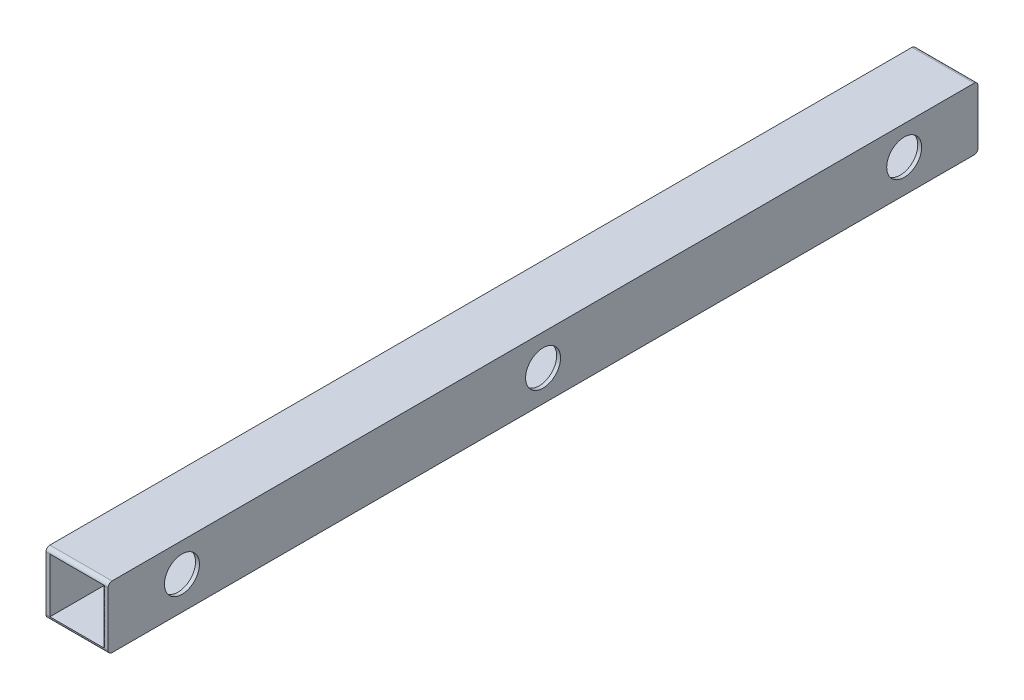
ISO-10303-21;
HEADER;
FILE_DESCRIPTION(('STEP AP214'),'2;1');
FILE_NAME('part.step','',(''),(''),'','','');
FILE_SCHEMA(('AUTOMOTIVE_DESIGN { 1 0 10303 214 1 1 1 1 }'));
ENDSEC;
DATA;
#1=APPLICATION_CONTEXT('core data for automotive mechanical design processes');
#2=APPLICATION_PROTOCOL_DEFINITION('international standard','automotive_design',2000,#1);
#3=PRODUCT_CONTEXT('',#1,'mechanical');
#4=PRODUCT('Part','Part','',(#3));
#5=PRODUCT_RELATED_PRODUCT_CATEGORY('part','',(#4));
#6=PRODUCT_DEFINITION_FORMATION('','',#4);
#7=PRODUCT_DEFINITION_CONTEXT('part definition',#1,'design');
#8=PRODUCT_DEFINITION('design','',#6,#7);
#9=PRODUCT_DEFINITION_SHAPE('','',#8);
#10=(LENGTH_UNIT() NAMED_UNIT(*) SI_UNIT(.MILLI.,.METRE.));
#11=(NAMED_UNIT(*) PLANE_ANGLE_UNIT() SI_UNIT($,.RADIAN.));
#12=(NAMED_UNIT(*) SI_UNIT($,.STERADIAN.) SOLID_ANGLE_UNIT());
#13=UNCERTAINTY_MEASURE_WITH_UNIT(LENGTH_MEASURE(1.E-05),#10,'distance_accuracy_value','');
#14=(GEOMETRIC_REPRESENTATION_CONTEXT(3) GLOBAL_UNCERTAINTY_ASSIGNED_CONTEXT((#13)) GLOBAL_UNIT_ASSIGNED_CONTEXT((#10,
#11,#12)) REPRESENTATION_CONTEXT('',''));
#15=CARTESIAN_POINT('',(0.,0.,0.));
#16=DIRECTION('',(0.,0.,1.));
#17=DIRECTION('',(1.,0.,0.));
#18=AXIS2_PLACEMENT_3D('',#15,#16,#17);
#19=CARTESIAN_POINT('',(0.,0.,-355.6));
#20=DIRECTION('',(0.,0.,-1.));
#21=DIRECTION('',(-1.,0.,0.));
#22=AXIS2_PLACEMENT_3D('',#19,#20,#21);
#23=PLANE('',#22);
#24=DIRECTION('',(0.,1.,0.));
#25=VECTOR('',#24,1.);
#26=CARTESIAN_POINT('',(25.4,-25.4,-355.6));
#27=LINE('',#26,#25);
#28=CARTESIAN_POINT('',(25.4,-22.225,-355.6));
#29=VERTEX_POINT('',#28);
#30=CARTESIAN_POINT('',(25.4,22.225,-355.6));
#31=VERTEX_POINT('',#30);
#32=EDGE_CURVE('E188',#29,#31,#27,.T.);
#33=ORIENTED_EDGE('',*,*,#32,.F.);
#34=DIRECTION('',(1.,0.,0.));
#35=VECTOR('',#34,1.);
#36=CARTESIAN_POINT('',(0.,-22.225,-355.6));
#37=LINE('',#36,#35);
#38=CARTESIAN_POINT('',(22.225,-22.225,-355.6));
#39=VERTEX_POINT('',#38);
#40=EDGE_CURVE('E11',#29,#39,#37,.F.);
#41=ORIENTED_EDGE('',*,*,#40,.T.);
#42=DIRECTION('',(0.,1.,0.));
#43=VECTOR('',#42,1.);
#44=CARTESIAN_POINT('',(22.225,-22.225,-355.6));
#45=LINE('',#44,#43);
#46=CARTESIAN_POINT('',(22.225,22.225,-355.6));
#47=VERTEX_POINT('',#46);
#48=EDGE_CURVE('E179',#39,#47,#45,.T.);
#49=ORIENTED_EDGE('',*,*,#48,.T.);
#50=DIRECTION('',(-1.,0.,0.));
#51=VECTOR('',#50,1.);
#52=CARTESIAN_POINT('',(0.,22.225,-355.6));
#53=LINE('',#52,#51);
#54=EDGE_CURVE('E51',#47,#31,#53,.F.);
#55=ORIENTED_EDGE('',*,*,#54,.T.);
#56=EDGE_LOOP('',(#33,#41,#49,#55));
#57=FACE_BOUND('',#56,.T.);
#58=ADVANCED_FACE('F36',(#57),#23,.T.);
#59=CARTESIAN_POINT('',(0.,0.,355.6));
#60=DIRECTION('',(0.,0.,-1.));
#61=DIRECTION('',(-1.,0.,0.));
#62=AXIS2_PLACEMENT_3D('',#59,#60,#61);
#63=PLANE('',#62);
#64=DIRECTION('',(0.,1.,0.));
#65=VECTOR('',#64,1.);
#66=CARTESIAN_POINT('',(25.4,-25.4,355.6));
#67=LINE('',#66,#65);
#68=CARTESIAN_POINT('',(25.4,-22.225,355.6));
#69=VERTEX_POINT('',#68);
#70=CARTESIAN_POINT('',(25.4,22.225,355.6));
#71=VERTEX_POINT('',#70);
#72=EDGE_CURVE('E147',#69,#71,#67,.T.);
#73=ORIENTED_EDGE('',*,*,#72,.T.);
#74=DIRECTION('',(-1.,0.,0.));
#75=VECTOR('',#74,1.);
#76=CARTESIAN_POINT('',(-25.4,22.225,355.6));
#77=LINE('',#76,#75);
#78=CARTESIAN_POINT('',(22.225,22.225,355.6));
#79=VERTEX_POINT('',#78);
#80=EDGE_CURVE('E130',#71,#79,#77,.T.);
#81=ORIENTED_EDGE('',*,*,#80,.T.);
#82=DIRECTION('',(0.,1.,0.));
#83=VECTOR('',#82,1.);
#84=CARTESIAN_POINT('',(22.225,-22.225,355.6));
#85=LINE('',#84,#83);
#86=CARTESIAN_POINT('',(22.225,-22.225,355.6));
#87=VERTEX_POINT('',#86);
#88=EDGE_CURVE('E138',#87,#79,#85,.T.);
#89=ORIENTED_EDGE('',*,*,#88,.F.);
#90=DIRECTION('',(1.,0.,0.));
#91=VECTOR('',#90,1.);
#92=CARTESIAN_POINT('',(25.4,-22.225,355.6));
#93=LINE('',#92,#91);
#94=EDGE_CURVE('E201',#87,#69,#93,.T.);
#95=ORIENTED_EDGE('',*,*,#94,.T.);
#96=EDGE_LOOP('',(#73,#81,#89,#95));
#97=FACE_BOUND('',#96,.T.);
#98=ADVANCED_FACE('F143',(#97),#63,.F.);
#99=CARTESIAN_POINT('',(25.4,-25.4,-355.6));
#100=DIRECTION('',(1.,0.,0.));
#101=DIRECTION('',(0.,0.,-1.));
#102=AXIS2_PLACEMENT_3D('',#99,#100,#101);
#103=PLANE('',#102);
#104=CARTESIAN_POINT('',(25.4,1.58750000000001,295.240391678118));
#105=DIRECTION('',(-1.,0.,0.));
#106=DIRECTION('',(0.,0.,-1.));
#107=AXIS2_PLACEMENT_3D('',#104,#105,#106);
#108=CIRCLE('',#107,14.2875);
#109=CARTESIAN_POINT('',(25.4,1.58750000000001,280.952891678118));
#110=VERTEX_POINT('',#109);
#111=EDGE_CURVE('E222',#110,#110,#108,.T.);
#112=ORIENTED_EDGE('',*,*,#111,.T.);
#113=EDGE_LOOP('',(#112));
#114=FACE_BOUND('',#113,.T.);
#115=CARTESIAN_POINT('',(25.4,0.,0.));
#116=DIRECTION('',(-1.,0.,0.));
#117=DIRECTION('',(0.,0.,1.));
#118=AXIS2_PLACEMENT_3D('',#115,#116,#117);
#119=CIRCLE('',#118,14.2875);
#120=CARTESIAN_POINT('',(25.4,0.,14.2875));
#121=VERTEX_POINT('',#120);
#122=EDGE_CURVE('E217',#121,#121,#119,.T.);
#123=ORIENTED_EDGE('',*,*,#122,.T.);
#124=EDGE_LOOP('',(#123));
#125=FACE_BOUND('',#124,.T.);
#126=CARTESIAN_POINT('',(25.4,1.58750000000001,-295.240391678118));
#127=DIRECTION('',(-1.,0.,0.));
#128=DIRECTION('',(0.,0.,1.));
#129=AXIS2_PLACEMENT_3D('',#126,#127,#128);
#130=CIRCLE('',#129,14.2875);
#131=CARTESIAN_POINT('',(25.4,1.58750000000001,-280.952891678118));
#132=VERTEX_POINT('',#131);
#133=EDGE_CURVE('E212',#132,#132,#130,.T.);
#134=ORIENTED_EDGE('',*,*,#133,.T.);
#135=EDGE_LOOP('',(#134));
#136=FACE_BOUND('',#135,.T.);
#137=DIRECTION('',(0.,0.,1.));
#138=VECTOR('',#137,1.);
#139=CARTESIAN_POINT('',(25.4,25.4,-355.6));
#140=LINE('',#139,#138);
#141=CARTESIAN_POINT('',(25.4,25.4,-352.425));
#142=VERTEX_POINT('',#141);
#143=CARTESIAN_POINT('',(25.4,25.4,352.425));
#144=VERTEX_POINT('',#143);
#145=EDGE_CURVE('E197',#142,#144,#140,.T.);
#146=ORIENTED_EDGE('',*,*,#145,.T.);
#147=CARTESIAN_POINT('',(25.4,22.225,352.425));
#148=DIRECTION('',(1.,0.,0.));
#149=DIRECTION('',(0.,0.,-1.));
#150=AXIS2_PLACEMENT_3D('',#147,#148,#149);
#151=CIRCLE('',#150,3.175);
#152=EDGE_CURVE('E245',#144,#71,#151,.T.);
#153=ORIENTED_EDGE('',*,*,#152,.T.);
#154=ORIENTED_EDGE('',*,*,#72,.F.);
#155=CARTESIAN_POINT('',(25.4,-22.225,352.425));
#156=DIRECTION('',(1.,0.,0.));
#157=DIRECTION('',(0.,0.,-1.));
#158=AXIS2_PLACEMENT_3D('',#155,#156,#157);
#159=CIRCLE('',#158,3.175);
#160=CARTESIAN_POINT('',(25.4,-25.4,352.425));
#161=VERTEX_POINT('',#160);
#162=EDGE_CURVE('E243',#69,#161,#159,.T.);
#163=ORIENTED_EDGE('',*,*,#162,.T.);
#164=DIRECTION('',(0.,0.,1.));
#165=VECTOR('',#164,1.);
#166=CARTESIAN_POINT('',(25.4,-25.4,-355.6));
#167=LINE('',#166,#165);
#168=CARTESIAN_POINT('',(25.4,-25.4,-352.425));
#169=VERTEX_POINT('',#168);
#170=EDGE_CURVE('E198',#169,#161,#167,.T.);
#171=ORIENTED_EDGE('',*,*,#170,.F.);
#172=CARTESIAN_POINT('',(25.4,-22.225,-352.425));
#173=DIRECTION('',(1.,0.,0.));
#174=DIRECTION('',(0.,0.,-1.));
#175=AXIS2_PLACEMENT_3D('',#172,#173,#174);
#176=CIRCLE('',#175,3.175);
#177=EDGE_CURVE('E58',#169,#29,#176,.T.);
#178=ORIENTED_EDGE('',*,*,#177,.T.);
#179=ORIENTED_EDGE('',*,*,#32,.T.);
#180=CARTESIAN_POINT('',(25.4,22.225,-352.425));
#181=DIRECTION('',(1.,0.,0.));
#182=DIRECTION('',(0.,0.,-1.));
#183=AXIS2_PLACEMENT_3D('',#180,#181,#182);
#184=CIRCLE('',#183,3.175);
#185=EDGE_CURVE('E240',#31,#142,#184,.T.);
#186=ORIENTED_EDGE('',*,*,#185,.T.);
#187=EDGE_LOOP('',(#146,#153,#154,#163,#171,#178,#179,#186));
#188=FACE_BOUND('',#187,.T.);
#189=ADVANCED_FACE('F273',(#114,#125,#136,#188),#103,.T.);
#190=CARTESIAN_POINT('',(-25.4,-25.4,-355.6));
#191=DIRECTION('',(0.,-1.,0.));
#192=DIRECTION('',(0.,0.,-1.));
#193=AXIS2_PLACEMENT_3D('',#190,#191,#192);
#194=PLANE('',#193);
#195=ORIENTED_EDGE('',*,*,#170,.T.);
#196=DIRECTION('',(1.,0.,0.));
#197=VECTOR('',#196,1.);
#198=CARTESIAN_POINT('',(-25.4,-25.4,352.425));
#199=LINE('',#198,#197);
#200=CARTESIAN_POINT('',(-25.4,-25.4,352.425));
#201=VERTEX_POINT('',#200);
#202=EDGE_CURVE('E250',#161,#201,#199,.F.);
#203=ORIENTED_EDGE('',*,*,#202,.T.);
#204=DIRECTION('',(0.,0.,1.));
#205=VECTOR('',#204,1.);
#206=CARTESIAN_POINT('',(-25.4,-25.4,-355.6));
#207=LINE('',#206,#205);
#208=CARTESIAN_POINT('',(-25.4,-25.4,-352.425));
#209=VERTEX_POINT('',#208);
#210=EDGE_CURVE('E202',#209,#201,#207,.T.);
#211=ORIENTED_EDGE('',*,*,#210,.F.);
#212=DIRECTION('',(1.,0.,0.));
#213=VECTOR('',#212,1.);
#214=CARTESIAN_POINT('',(-25.4,-25.4,-352.425));
#215=LINE('',#214,#213);
#216=EDGE_CURVE('E247',#209,#169,#215,.T.);
#217=ORIENTED_EDGE('',*,*,#216,.T.);
#218=EDGE_LOOP('',(#195,#203,#211,#217));
#219=FACE_BOUND('',#218,.T.);
#220=ADVANCED_FACE('F271',(#219),#194,.T.);
#221=CARTESIAN_POINT('',(-25.4,-25.4,-355.6));
#222=DIRECTION('',(-1.,0.,0.));
#223=DIRECTION('',(0.,0.,1.));
#224=AXIS2_PLACEMENT_3D('',#221,#222,#223);
#225=PLANE('',#224);
#226=CARTESIAN_POINT('',(-25.4,1.58750000000001,295.240391678118));
#227=DIRECTION('',(-1.,0.,0.));
#228=DIRECTION('',(0.,0.,-1.));
#229=AXIS2_PLACEMENT_3D('',#226,#227,#228);
#230=CIRCLE('',#229,14.2875);
#231=CARTESIAN_POINT('',(-25.4,1.58750000000001,280.952891678118));
#232=VERTEX_POINT('',#231);
#233=EDGE_CURVE('E499',#232,#232,#230,.T.);
#234=ORIENTED_EDGE('',*,*,#233,.F.);
#235=EDGE_LOOP('',(#234));
#236=FACE_BOUND('',#235,.T.);
#237=CARTESIAN_POINT('',(-25.4,0.,0.));
#238=DIRECTION('',(-1.,0.,0.));
#239=DIRECTION('',(0.,0.,1.));
#240=AXIS2_PLACEMENT_3D('',#237,#238,#239);
#241=CIRCLE('',#240,14.2875);
#242=CARTESIAN_POINT('',(-25.4,0.,14.2875));
#243=VERTEX_POINT('',#242);
#244=EDGE_CURVE('E492',#243,#243,#241,.T.);
#245=ORIENTED_EDGE('',*,*,#244,.F.);
#246=EDGE_LOOP('',(#245));
#247=FACE_BOUND('',#246,.T.);
#248=CARTESIAN_POINT('',(-25.4,1.58750000000001,-295.240391678118));
#249=DIRECTION('',(-1.,0.,0.));
#250=DIRECTION('',(0.,0.,1.));
#251=AXIS2_PLACEMENT_3D('',#248,#249,#250);
#252=CIRCLE('',#251,14.2875);
#253=CARTESIAN_POINT('',(-25.4,1.58750000000001,-280.952891678118));
#254=VERTEX_POINT('',#253);
#255=EDGE_CURVE('E483',#254,#254,#252,.T.);
#256=ORIENTED_EDGE('',*,*,#255,.F.);
#257=EDGE_LOOP('',(#256));
#258=FACE_BOUND('',#257,.T.);
#259=DIRECTION('',(0.,-1.,0.));
#260=VECTOR('',#259,1.);
#261=CARTESIAN_POINT('',(-25.4,-25.4,355.6));
#262=LINE('',#261,#260);
#263=CARTESIAN_POINT('',(-25.4,22.225,355.6));
#264=VERTEX_POINT('',#263);
#265=CARTESIAN_POINT('',(-25.4,-22.225,355.6));
#266=VERTEX_POINT('',#265);
#267=EDGE_CURVE('E176',#264,#266,#262,.T.);
#268=ORIENTED_EDGE('',*,*,#267,.F.);
#269=CARTESIAN_POINT('',(-25.4,22.225,352.425));
#270=DIRECTION('',(-1.,0.,0.));
#271=DIRECTION('',(0.,0.,1.));
#272=AXIS2_PLACEMENT_3D('',#269,#270,#271);
#273=CIRCLE('',#272,3.175);
#274=CARTESIAN_POINT('',(-25.4,25.4,352.425));
#275=VERTEX_POINT('',#274);
#276=EDGE_CURVE('E233',#264,#275,#273,.T.);
#277=ORIENTED_EDGE('',*,*,#276,.T.);
#278=DIRECTION('',(0.,0.,1.));
#279=VECTOR('',#278,1.);
#280=CARTESIAN_POINT('',(-25.4,25.4,-355.6));
#281=LINE('',#280,#279);
#282=CARTESIAN_POINT('',(-25.4,25.4,-352.425));
#283=VERTEX_POINT('',#282);
#284=EDGE_CURVE('E205',#283,#275,#281,.T.);
#285=ORIENTED_EDGE('',*,*,#284,.F.);
#286=CARTESIAN_POINT('',(-25.4,22.225,-352.425));
#287=DIRECTION('',(-1.,0.,0.));
#288=DIRECTION('',(0.,0.,1.));
#289=AXIS2_PLACEMENT_3D('',#286,#287,#288);
#290=CIRCLE('',#289,3.175);
#291=CARTESIAN_POINT('',(-25.4,22.225,-355.6));
#292=VERTEX_POINT('',#291);
#293=EDGE_CURVE('E148',#283,#292,#290,.T.);
#294=ORIENTED_EDGE('',*,*,#293,.T.);
#295=DIRECTION('',(0.,-1.,0.));
#296=VECTOR('',#295,1.);
#297=CARTESIAN_POINT('',(-25.4,-25.4,-355.6));
#298=LINE('',#297,#296);
#299=CARTESIAN_POINT('',(-25.4,-22.225,-355.6));
#300=VERTEX_POINT('',#299);
#301=EDGE_CURVE('E194',#292,#300,#298,.T.);
#302=ORIENTED_EDGE('',*,*,#301,.T.);
#303=CARTESIAN_POINT('',(-25.4,-22.225,-352.425));
#304=DIRECTION('',(-1.,0.,0.));
#305=DIRECTION('',(0.,0.,1.));
#306=AXIS2_PLACEMENT_3D('',#303,#304,#305);
#307=CIRCLE('',#306,3.175);
#308=EDGE_CURVE('E229',#300,#209,#307,.T.);
#309=ORIENTED_EDGE('',*,*,#308,.T.);
#310=ORIENTED_EDGE('',*,*,#210,.T.);
#311=CARTESIAN_POINT('',(-25.4,-22.225,352.425));
#312=DIRECTION('',(-1.,0.,0.));
#313=DIRECTION('',(0.,0.,1.));
#314=AXIS2_PLACEMENT_3D('',#311,#312,#313);
#315=CIRCLE('',#314,3.175);
#316=EDGE_CURVE('E231',#201,#266,#315,.T.);
#317=ORIENTED_EDGE('',*,*,#316,.T.);
#318=EDGE_LOOP('',(#268,#277,#285,#294,#302,#309,#310,#317));
#319=FACE_BOUND('',#318,.T.);
#320=ADVANCED_FACE('F264',(#236,#247,#258,#319),#225,.T.);
#321=CARTESIAN_POINT('',(-25.4,25.4,-355.6));
#322=DIRECTION('',(0.,1.,0.));
#323=DIRECTION('',(0.,0.,1.));
#324=AXIS2_PLACEMENT_3D('',#321,#322,#323);
#325=PLANE('',#324);
#326=ORIENTED_EDGE('',*,*,#284,.T.);
#327=DIRECTION('',(-1.,0.,0.));
#328=VECTOR('',#327,1.);
#329=CARTESIAN_POINT('',(25.4,25.4,352.425));
#330=LINE('',#329,#328);
#331=EDGE_CURVE('E238',#275,#144,#330,.F.);
#332=ORIENTED_EDGE('',*,*,#331,.T.);
#333=ORIENTED_EDGE('',*,*,#145,.F.);
#334=DIRECTION('',(-1.,0.,0.));
#335=VECTOR('',#334,1.);
#336=CARTESIAN_POINT('',(-25.4,25.4,-352.425));
#337=LINE('',#336,#335);
#338=EDGE_CURVE('E235',#142,#283,#337,.T.);
#339=ORIENTED_EDGE('',*,*,#338,.T.);
#340=EDGE_LOOP('',(#326,#332,#333,#339));
#341=FACE_BOUND('',#340,.T.);
#342=ADVANCED_FACE('F291',(#341),#325,.T.);
#343=DIRECTION('',(0.,-1.,0.));
#344=VECTOR('',#343,1.);
#345=CARTESIAN_POINT('',(-22.225,-22.225,-355.6));
#346=LINE('',#345,#344);
#347=CARTESIAN_POINT('',(-22.225,22.225,-355.6));
#348=VERTEX_POINT('',#347);
#349=CARTESIAN_POINT('',(-22.225,-22.225,-355.6));
#350=VERTEX_POINT('',#349);
#351=EDGE_CURVE('E182',#348,#350,#346,.T.);
#352=ORIENTED_EDGE('',*,*,#351,.T.);
#353=DIRECTION('',(1.,0.,0.));
#354=VECTOR('',#353,1.);
#355=CARTESIAN_POINT('',(0.,-22.225,-355.6));
#356=LINE('',#355,#354);
#357=EDGE_CURVE('E44',#350,#300,#356,.F.);
#358=ORIENTED_EDGE('',*,*,#357,.T.);
#359=ORIENTED_EDGE('',*,*,#301,.F.);
#360=DIRECTION('',(-1.,0.,0.));
#361=VECTOR('',#360,1.);
#362=CARTESIAN_POINT('',(0.,22.225,-355.6));
#363=LINE('',#362,#361);
#364=EDGE_CURVE('E253',#292,#348,#363,.F.);
#365=ORIENTED_EDGE('',*,*,#364,.T.);
#366=EDGE_LOOP('',(#352,#358,#359,#365));
#367=FACE_BOUND('',#366,.T.);
#368=ADVANCED_FACE('F257',(#367),#23,.T.);
#369=CARTESIAN_POINT('',(22.225,-22.225,-355.6));
#370=DIRECTION('',(1.,0.,0.));
#371=DIRECTION('',(0.,0.,-1.));
#372=AXIS2_PLACEMENT_3D('',#369,#370,#371);
#373=PLANE('',#372);
#374=CARTESIAN_POINT('',(22.225,1.58750000000001,295.240391678118));
#375=DIRECTION('',(1.,0.,0.));
#376=DIRECTION('',(0.,0.,-1.));
#377=AXIS2_PLACEMENT_3D('',#374,#375,#376);
#378=CIRCLE('',#377,14.2875);
#379=CARTESIAN_POINT('',(22.225,1.58750000000001,280.952891678118));
#380=VERTEX_POINT('',#379);
#381=EDGE_CURVE('E221',#380,#380,#378,.T.);
#382=ORIENTED_EDGE('',*,*,#381,.T.);
#383=EDGE_LOOP('',(#382));
#384=FACE_BOUND('',#383,.T.);
#385=CARTESIAN_POINT('',(22.225,0.,0.));
#386=DIRECTION('',(1.,0.,0.));
#387=DIRECTION('',(0.,0.,-1.));
#388=AXIS2_PLACEMENT_3D('',#385,#386,#387);
#389=CIRCLE('',#388,14.2875);
#390=CARTESIAN_POINT('',(22.225,0.,-14.2875));
#391=VERTEX_POINT('',#390);
#392=EDGE_CURVE('E216',#391,#391,#389,.T.);
#393=ORIENTED_EDGE('',*,*,#392,.T.);
#394=EDGE_LOOP('',(#393));
#395=FACE_BOUND('',#394,.T.);
#396=CARTESIAN_POINT('',(22.225,1.58750000000001,-295.240391678118));
#397=DIRECTION('',(1.,0.,0.));
#398=DIRECTION('',(0.,0.,-1.));
#399=AXIS2_PLACEMENT_3D('',#396,#397,#398);
#400=CIRCLE('',#399,14.2875);
#401=CARTESIAN_POINT('',(22.225,1.58750000000001,-309.527891678118));
#402=VERTEX_POINT('',#401);
#403=EDGE_CURVE('E164',#402,#402,#400,.T.);
#404=ORIENTED_EDGE('',*,*,#403,.T.);
#405=EDGE_LOOP('',(#404));
#406=FACE_BOUND('',#405,.T.);
#407=DIRECTION('',(0.,0.,1.));
#408=VECTOR('',#407,1.);
#409=CARTESIAN_POINT('',(22.225,-22.225,-355.6));
#410=LINE('',#409,#408);
#411=EDGE_CURVE('E162',#39,#87,#410,.T.);
#412=ORIENTED_EDGE('',*,*,#411,.T.);
#413=ORIENTED_EDGE('',*,*,#88,.T.);
#414=DIRECTION('',(0.,0.,1.));
#415=VECTOR('',#414,1.);
#416=CARTESIAN_POINT('',(22.225,22.225,-355.6));
#417=LINE('',#416,#415);
#418=EDGE_CURVE('E151',#47,#79,#417,.T.);
#419=ORIENTED_EDGE('',*,*,#418,.F.);
#420=ORIENTED_EDGE('',*,*,#48,.F.);
#421=EDGE_LOOP('',(#412,#413,#419,#420));
#422=FACE_BOUND('',#421,.T.);
#423=ADVANCED_FACE('F160',(#384,#395,#406,#422),#373,.F.);
#424=CARTESIAN_POINT('',(-22.225,-22.225,-355.6));
#425=DIRECTION('',(0.,-1.,0.));
#426=DIRECTION('',(0.,0.,-1.));
#427=AXIS2_PLACEMENT_3D('',#424,#425,#426);
#428=PLANE('',#427);
#429=DIRECTION('',(0.,0.,1.));
#430=VECTOR('',#429,1.);
#431=CARTESIAN_POINT('',(-22.225,-22.225,-355.6));
#432=LINE('',#431,#430);
#433=CARTESIAN_POINT('',(-22.225,-22.225,355.6));
#434=VERTEX_POINT('',#433);
#435=EDGE_CURVE('E189',#350,#434,#432,.T.);
#436=ORIENTED_EDGE('',*,*,#435,.T.);
#437=DIRECTION('',(1.,0.,0.));
#438=VECTOR('',#437,1.);
#439=CARTESIAN_POINT('',(-22.225,-22.225,355.6));
#440=LINE('',#439,#438);
#441=EDGE_CURVE('E173',#434,#87,#440,.T.);
#442=ORIENTED_EDGE('',*,*,#441,.T.);
#443=ORIENTED_EDGE('',*,*,#411,.F.);
#444=DIRECTION('',(1.,0.,0.));
#445=VECTOR('',#444,1.);
#446=CARTESIAN_POINT('',(-22.225,-22.225,-355.6));
#447=LINE('',#446,#445);
#448=EDGE_CURVE('E158',#350,#39,#447,.T.);
#449=ORIENTED_EDGE('',*,*,#448,.F.);
#450=EDGE_LOOP('',(#436,#442,#443,#449));
#451=FACE_BOUND('',#450,.T.);
#452=ADVANCED_FACE('F282',(#451),#428,.F.);
#453=CARTESIAN_POINT('',(-22.225,-22.225,-355.6));
#454=DIRECTION('',(-1.,0.,0.));
#455=DIRECTION('',(0.,0.,1.));
#456=AXIS2_PLACEMENT_3D('',#453,#454,#455);
#457=PLANE('',#456);
#458=CARTESIAN_POINT('',(-22.225,1.58750000000001,295.240391678118));
#459=DIRECTION('',(-1.,0.,0.));
#460=DIRECTION('',(0.,0.,1.));
#461=AXIS2_PLACEMENT_3D('',#458,#459,#460);
#462=CIRCLE('',#461,14.2875);
#463=CARTESIAN_POINT('',(-22.225,1.58750000000001,309.527891678118));
#464=VERTEX_POINT('',#463);
#465=EDGE_CURVE('E218',#464,#464,#462,.T.);
#466=ORIENTED_EDGE('',*,*,#465,.T.);
#467=EDGE_LOOP('',(#466));
#468=FACE_BOUND('',#467,.T.);
#469=CARTESIAN_POINT('',(-22.225,0.,0.));
#470=DIRECTION('',(-1.,0.,0.));
#471=DIRECTION('',(0.,0.,1.));
#472=AXIS2_PLACEMENT_3D('',#469,#470,#471);
#473=CIRCLE('',#472,14.2875);
#474=CARTESIAN_POINT('',(-22.225,0.,14.2875));
#475=VERTEX_POINT('',#474);
#476=EDGE_CURVE('E213',#475,#475,#473,.T.);
#477=ORIENTED_EDGE('',*,*,#476,.T.);
#478=EDGE_LOOP('',(#477));
#479=FACE_BOUND('',#478,.T.);
#480=CARTESIAN_POINT('',(-22.225,1.58750000000001,-295.240391678118));
#481=DIRECTION('',(-1.,0.,0.));
#482=DIRECTION('',(0.,0.,1.));
#483=AXIS2_PLACEMENT_3D('',#480,#481,#482);
#484=CIRCLE('',#483,14.2875);
#485=CARTESIAN_POINT('',(-22.225,1.58750000000001,-280.952891678118));
#486=VERTEX_POINT('',#485);
#487=EDGE_CURVE('E167',#486,#486,#484,.T.);
#488=ORIENTED_EDGE('',*,*,#487,.T.);
#489=EDGE_LOOP('',(#488));
#490=FACE_BOUND('',#489,.T.);
#491=DIRECTION('',(0.,0.,1.));
#492=VECTOR('',#491,1.);
#493=CARTESIAN_POINT('',(-22.225,22.225,-355.6));
#494=LINE('',#493,#492);
#495=CARTESIAN_POINT('',(-22.225,22.225,355.6));
#496=VERTEX_POINT('',#495);
#497=EDGE_CURVE('E157',#348,#496,#494,.T.);
#498=ORIENTED_EDGE('',*,*,#497,.T.);
#499=DIRECTION('',(0.,-1.,0.));
#500=VECTOR('',#499,1.);
#501=CARTESIAN_POINT('',(-22.225,-22.225,355.6));
#502=LINE('',#501,#500);
#503=EDGE_CURVE('E137',#496,#434,#502,.T.);
#504=ORIENTED_EDGE('',*,*,#503,.T.);
#505=ORIENTED_EDGE('',*,*,#435,.F.);
#506=ORIENTED_EDGE('',*,*,#351,.F.);
#507=EDGE_LOOP('',(#498,#504,#505,#506));
#508=FACE_BOUND('',#507,.T.);
#509=ADVANCED_FACE('F285',(#468,#479,#490,#508),#457,.F.);
#510=CARTESIAN_POINT('',(-22.225,22.225,-355.6));
#511=DIRECTION('',(0.,1.,0.));
#512=DIRECTION('',(0.,0.,1.));
#513=AXIS2_PLACEMENT_3D('',#510,#511,#512);
#514=PLANE('',#513);
#515=ORIENTED_EDGE('',*,*,#418,.T.);
#516=DIRECTION('',(-1.,0.,0.));
#517=VECTOR('',#516,1.);
#518=CARTESIAN_POINT('',(-22.225,22.225,355.6));
#519=LINE('',#518,#517);
#520=EDGE_CURVE('E126',#79,#496,#519,.T.);
#521=ORIENTED_EDGE('',*,*,#520,.T.);
#522=ORIENTED_EDGE('',*,*,#497,.F.);
#523=DIRECTION('',(-1.,0.,0.));
#524=VECTOR('',#523,1.);
#525=CARTESIAN_POINT('',(-22.225,22.225,-355.6));
#526=LINE('',#525,#524);
#527=EDGE_CURVE('E154',#47,#348,#526,.T.);
#528=ORIENTED_EDGE('',*,*,#527,.F.);
#529=EDGE_LOOP('',(#515,#521,#522,#528));
#530=FACE_BOUND('',#529,.T.);
#531=ADVANCED_FACE('F152',(#530),#514,.F.);
#532=ORIENTED_EDGE('',*,*,#503,.F.);
#533=DIRECTION('',(-1.,0.,0.));
#534=VECTOR('',#533,1.);
#535=CARTESIAN_POINT('',(-25.4,22.225,355.6));
#536=LINE('',#535,#534);
#537=EDGE_CURVE('E132',#496,#264,#536,.T.);
#538=ORIENTED_EDGE('',*,*,#537,.T.);
#539=ORIENTED_EDGE('',*,*,#267,.T.);
#540=DIRECTION('',(1.,0.,0.));
#541=VECTOR('',#540,1.);
#542=CARTESIAN_POINT('',(25.4,-22.225,355.6));
#543=LINE('',#542,#541);
#544=EDGE_CURVE('E224',#266,#434,#543,.T.);
#545=ORIENTED_EDGE('',*,*,#544,.T.);
#546=EDGE_LOOP('',(#532,#538,#539,#545));
#547=FACE_BOUND('',#546,.T.);
#548=ADVANCED_FACE('F280',(#547),#63,.F.);
#549=CARTESIAN_POINT('',(25.4,1.58750000000001,-295.240391678118));
#550=DIRECTION('',(-1.,0.,0.));
#551=DIRECTION('',(0.,0.,1.));
#552=AXIS2_PLACEMENT_3D('',#549,#550,#551);
#553=CYLINDRICAL_SURFACE('',#552,14.2875);
#554=ORIENTED_EDGE('',*,*,#255,.T.);
#555=EDGE_LOOP('',(#554));
#556=FACE_BOUND('',#555,.T.);
#557=ORIENTED_EDGE('',*,*,#487,.F.);
#558=EDGE_LOOP('',(#557));
#559=FACE_BOUND('',#558,.T.);
#560=ADVANCED_FACE('F358',(#556,#559),#553,.F.);
#561=ORIENTED_EDGE('',*,*,#133,.F.);
#562=EDGE_LOOP('',(#561));
#563=FACE_BOUND('',#562,.T.);
#564=ORIENTED_EDGE('',*,*,#403,.F.);
#565=EDGE_LOOP('',(#564));
#566=FACE_BOUND('',#565,.T.);
#567=ADVANCED_FACE('F461',(#563,#566),#553,.F.);
#568=CARTESIAN_POINT('',(25.4,0.,0.));
#569=DIRECTION('',(-1.,0.,0.));
#570=DIRECTION('',(0.,0.,1.));
#571=AXIS2_PLACEMENT_3D('',#568,#569,#570);
#572=CYLINDRICAL_SURFACE('',#571,14.2875);
#573=ORIENTED_EDGE('',*,*,#244,.T.);
#574=EDGE_LOOP('',(#573));
#575=FACE_BOUND('',#574,.T.);
#576=ORIENTED_EDGE('',*,*,#476,.F.);
#577=EDGE_LOOP('',(#576));
#578=FACE_BOUND('',#577,.T.);
#579=ADVANCED_FACE('F451',(#575,#578),#572,.F.);
#580=ORIENTED_EDGE('',*,*,#122,.F.);
#581=EDGE_LOOP('',(#580));
#582=FACE_BOUND('',#581,.T.);
#583=ORIENTED_EDGE('',*,*,#392,.F.);
#584=EDGE_LOOP('',(#583));
#585=FACE_BOUND('',#584,.T.);
#586=ADVANCED_FACE('F442',(#582,#585),#572,.F.);
#587=CARTESIAN_POINT('',(25.4,1.58750000000001,295.240391678118));
#588=DIRECTION('',(-1.,0.,0.));
#589=DIRECTION('',(0.,0.,1.));
#590=AXIS2_PLACEMENT_3D('',#587,#588,#589);
#591=CYLINDRICAL_SURFACE('',#590,14.2875);
#592=ORIENTED_EDGE('',*,*,#233,.T.);
#593=EDGE_LOOP('',(#592));
#594=FACE_BOUND('',#593,.T.);
#595=ORIENTED_EDGE('',*,*,#465,.F.);
#596=EDGE_LOOP('',(#595));
#597=FACE_BOUND('',#596,.T.);
#598=ADVANCED_FACE('F432',(#594,#597),#591,.F.);
#599=ORIENTED_EDGE('',*,*,#111,.F.);
#600=EDGE_LOOP('',(#599));
#601=FACE_BOUND('',#600,.T.);
#602=ORIENTED_EDGE('',*,*,#381,.F.);
#603=EDGE_LOOP('',(#602));
#604=FACE_BOUND('',#603,.T.);
#605=ADVANCED_FACE('F323',(#601,#604),#591,.F.);
#606=CARTESIAN_POINT('',(0.,22.225,352.425));
#607=DIRECTION('',(1.,0.,0.));
#608=DIRECTION('',(0.,0.,-1.));
#609=AXIS2_PLACEMENT_3D('',#606,#607,#608);
#610=CYLINDRICAL_SURFACE('',#609,3.175);
#611=ORIENTED_EDGE('',*,*,#152,.F.);
#612=ORIENTED_EDGE('',*,*,#331,.F.);
#613=ORIENTED_EDGE('',*,*,#276,.F.);
#614=ORIENTED_EDGE('',*,*,#537,.F.);
#615=ORIENTED_EDGE('',*,*,#520,.F.);
#616=ORIENTED_EDGE('',*,*,#80,.F.);
#617=EDGE_LOOP('',(#611,#612,#613,#614,#615,#616));
#618=FACE_BOUND('',#617,.T.);
#619=ADVANCED_FACE('F129',(#618),#610,.T.);
#620=CARTESIAN_POINT('',(0.,-22.225,352.425));
#621=DIRECTION('',(-1.,0.,0.));
#622=DIRECTION('',(0.,0.,1.));
#623=AXIS2_PLACEMENT_3D('',#620,#621,#622);
#624=CYLINDRICAL_SURFACE('',#623,3.175);
#625=ORIENTED_EDGE('',*,*,#316,.F.);
#626=ORIENTED_EDGE('',*,*,#202,.F.);
#627=ORIENTED_EDGE('',*,*,#162,.F.);
#628=ORIENTED_EDGE('',*,*,#94,.F.);
#629=ORIENTED_EDGE('',*,*,#441,.F.);
#630=ORIENTED_EDGE('',*,*,#544,.F.);
#631=EDGE_LOOP('',(#625,#626,#627,#628,#629,#630));
#632=FACE_BOUND('',#631,.T.);
#633=ADVANCED_FACE('F277',(#632),#624,.T.);
#634=CARTESIAN_POINT('',(-25.4,-22.225,-352.425));
#635=DIRECTION('',(1.,0.,0.));
#636=DIRECTION('',(0.,0.,-1.));
#637=AXIS2_PLACEMENT_3D('',#634,#635,#636);
#638=CYLINDRICAL_SURFACE('',#637,3.175);
#639=ORIENTED_EDGE('',*,*,#448,.T.);
#640=ORIENTED_EDGE('',*,*,#40,.F.);
#641=ORIENTED_EDGE('',*,*,#177,.F.);
#642=ORIENTED_EDGE('',*,*,#216,.F.);
#643=ORIENTED_EDGE('',*,*,#308,.F.);
#644=ORIENTED_EDGE('',*,*,#357,.F.);
#645=EDGE_LOOP('',(#639,#640,#641,#642,#643,#644));
#646=FACE_BOUND('',#645,.T.);
#647=ADVANCED_FACE('F268',(#646),#638,.T.);
#648=CARTESIAN_POINT('',(-25.4,22.225,-352.425));
#649=DIRECTION('',(-1.,0.,0.));
#650=DIRECTION('',(0.,0.,1.));
#651=AXIS2_PLACEMENT_3D('',#648,#649,#650);
#652=CYLINDRICAL_SURFACE('',#651,3.175);
#653=ORIENTED_EDGE('',*,*,#527,.T.);
#654=ORIENTED_EDGE('',*,*,#364,.F.);
#655=ORIENTED_EDGE('',*,*,#293,.F.);
#656=ORIENTED_EDGE('',*,*,#338,.F.);
#657=ORIENTED_EDGE('',*,*,#185,.F.);
#658=ORIENTED_EDGE('',*,*,#54,.F.);
#659=EDGE_LOOP('',(#653,#654,#655,#656,#657,#658));
#660=FACE_BOUND('',#659,.T.);
#661=ADVANCED_FACE('F38',(#660),#652,.T.);
#662=CLOSED_SHELL('',(#58,#98,#189,#220,#320,#342,#368,#423,#452,#509,#531,#548,#560,#567,#579,
#586,#598,#605,#619,#633,#647,#661));
#663=MANIFOLD_SOLID_BREP('B2',#662);
#664=ADVANCED_BREP_SHAPE_REPRESENTATION('',(#18,#663),#14);
#665=SHAPE_DEFINITION_REPRESENTATION(#9,#664);
ENDSEC;
END-ISO-10303-21;
